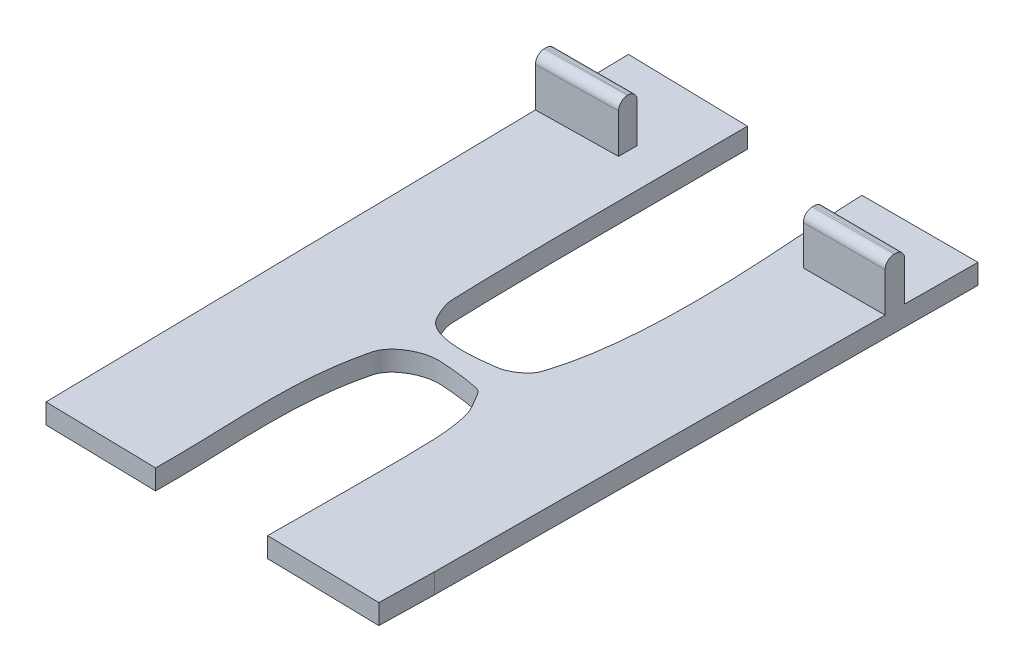
ISO-10303-21;
HEADER;
FILE_DESCRIPTION(('STEP AP214'),'2;1');
FILE_NAME('part.step','',(''),(''),'','','');
FILE_SCHEMA(('AUTOMOTIVE_DESIGN { 1 0 10303 214 1 1 1 1 }'));
ENDSEC;
DATA;
#1=APPLICATION_CONTEXT('core data for automotive mechanical design processes');
#2=APPLICATION_PROTOCOL_DEFINITION('international standard','automotive_design',2000,#1);
#3=PRODUCT_CONTEXT('',#1,'mechanical');
#4=PRODUCT('Part','Part','',(#3));
#5=PRODUCT_RELATED_PRODUCT_CATEGORY('part','',(#4));
#6=PRODUCT_DEFINITION_FORMATION('','',#4);
#7=PRODUCT_DEFINITION_CONTEXT('part definition',#1,'design');
#8=PRODUCT_DEFINITION('design','',#6,#7);
#9=PRODUCT_DEFINITION_SHAPE('','',#8);
#10=(LENGTH_UNIT() NAMED_UNIT(*) SI_UNIT(.MILLI.,.METRE.));
#11=(NAMED_UNIT(*) PLANE_ANGLE_UNIT() SI_UNIT($,.RADIAN.));
#12=(NAMED_UNIT(*) SI_UNIT($,.STERADIAN.) SOLID_ANGLE_UNIT());
#13=UNCERTAINTY_MEASURE_WITH_UNIT(LENGTH_MEASURE(1.E-05),#10,'distance_accuracy_value','');
#14=(GEOMETRIC_REPRESENTATION_CONTEXT(3) GLOBAL_UNCERTAINTY_ASSIGNED_CONTEXT((#13)) GLOBAL_UNIT_ASSIGNED_CONTEXT((#10,
#11,#12)) REPRESENTATION_CONTEXT('',''));
#15=CARTESIAN_POINT('',(0.,0.,0.));
#16=DIRECTION('',(0.,0.,1.));
#17=DIRECTION('',(1.,0.,0.));
#18=AXIS2_PLACEMENT_3D('',#15,#16,#17);
#19=CARTESIAN_POINT('',(88.3389714618213,1.,24.135500369023));
#20=DIRECTION('',(0.999866385580923,0.,-0.0163465894100423));
#21=DIRECTION('',(-0.0163465894100423,0.,-0.999866385580923));
#22=AXIS2_PLACEMENT_3D('',#19,#20,#21);
#23=PLANE('',#22);
#24=DIRECTION('',(0.0163465894100423,0.,0.999866385580923));
#25=VECTOR('',#24,1.);
#26=CARTESIAN_POINT('',(88.3389714618213,1.,24.135500369023));
#27=LINE('',#26,#25);
#28=CARTESIAN_POINT('',(87.6036054088789,1.,-20.8443898692875));
#29=VERTEX_POINT('',#28);
#30=CARTESIAN_POINT('',(87.6646436738405,1.,-17.1108826624673));
#31=VERTEX_POINT('',#30);
#32=EDGE_CURVE('E227',#29,#31,#27,.T.);
#33=ORIENTED_EDGE('',*,*,#32,.F.);
#34=DIRECTION('',(0.,1.,0.));
#35=VECTOR('',#34,1.);
#36=CARTESIAN_POINT('',(87.6036054088789,-9.,-20.8443898692875));
#37=LINE('',#36,#35);
#38=CARTESIAN_POINT('',(87.6036054088789,0.,-20.8443898692875));
#39=VERTEX_POINT('',#38);
#40=EDGE_CURVE('E352',#39,#29,#37,.T.);
#41=ORIENTED_EDGE('',*,*,#40,.F.);
#42=DIRECTION('',(0.0163465894100423,0.,0.999866385580923));
#43=VECTOR('',#42,1.);
#44=CARTESIAN_POINT('',(88.3389714618213,0.,24.135500369023));
#45=LINE('',#44,#43);
#46=CARTESIAN_POINT('',(88.0876826334834,0.,8.76500036902299));
#47=VERTEX_POINT('',#46);
#48=EDGE_CURVE('E327',#39,#47,#45,.T.);
#49=ORIENTED_EDGE('',*,*,#48,.T.);
#50=DIRECTION('',(0.,1.,0.));
#51=VECTOR('',#50,1.);
#52=CARTESIAN_POINT('',(88.0876826334834,-9.,8.76500036902299));
#53=LINE('',#52,#51);
#54=CARTESIAN_POINT('',(88.0876826334834,1.,8.76500036902299));
#55=VERTEX_POINT('',#54);
#56=EDGE_CURVE('E329',#47,#55,#53,.T.);
#57=ORIENTED_EDGE('',*,*,#56,.T.);
#58=CARTESIAN_POINT('',(87.6809902632506,1.,-16.1110162768864));
#59=VERTEX_POINT('',#58);
#60=EDGE_CURVE('E223',#59,#55,#27,.T.);
#61=ORIENTED_EDGE('',*,*,#60,.F.);
#62=DIRECTION('',(0.,-1.,0.));
#63=VECTOR('',#62,1.);
#64=CARTESIAN_POINT('',(87.6809902632506,3.42,-16.1110162768864));
#65=LINE('',#64,#63);
#66=CARTESIAN_POINT('',(87.6809902632506,2.97,-16.1110162768864));
#67=VERTEX_POINT('',#66);
#68=EDGE_CURVE('E448',#67,#59,#65,.T.);
#69=ORIENTED_EDGE('',*,*,#68,.F.);
#70=CARTESIAN_POINT('',(87.6736342980161,2.97,-16.5609561503978));
#71=DIRECTION('',(0.999866385580923,0.,-0.0163465894100423));
#72=DIRECTION('',(-0.0163465894100423,0.,-0.999866385580923));
#73=AXIS2_PLACEMENT_3D('',#70,#71,#72);
#74=CIRCLE('',#73,0.45);
#75=CARTESIAN_POINT('',(87.6736342980161,3.42,-16.5609561503978));
#76=VERTEX_POINT('',#75);
#77=EDGE_CURVE('E334',#67,#76,#74,.F.);
#78=ORIENTED_EDGE('',*,*,#77,.T.);
#79=DIRECTION('',(0.0163465894100351,0.,0.999866385580923));
#80=VECTOR('',#79,1.);
#81=CARTESIAN_POINT('',(87.6646436738405,3.42,-17.1108826624673));
#82=LINE('',#81,#80);
#83=CARTESIAN_POINT('',(87.6720006220694,3.42,-16.6608826624673));
#84=VERTEX_POINT('',#83);
#85=EDGE_CURVE('E417',#84,#76,#82,.T.);
#86=ORIENTED_EDGE('',*,*,#85,.F.);
#87=CARTESIAN_POINT('',(87.6720006220694,2.97,-16.6608826624673));
#88=DIRECTION('',(0.999866385580923,0.,-0.0163465894100423));
#89=DIRECTION('',(0.0163465894100423,0.,0.999866385580923));
#90=AXIS2_PLACEMENT_3D('',#87,#88,#89);
#91=ELLIPSE('',#90,0.450060134523424,0.45);
#92=CARTESIAN_POINT('',(87.6646436738405,2.97,-17.1108826624673));
#93=VERTEX_POINT('',#92);
#94=EDGE_CURVE('E322',#84,#93,#91,.F.);
#95=ORIENTED_EDGE('',*,*,#94,.T.);
#96=DIRECTION('',(0.,-1.,0.));
#97=VECTOR('',#96,1.);
#98=CARTESIAN_POINT('',(87.6646436738405,3.42,-17.1108826624673));
#99=LINE('',#98,#97);
#100=EDGE_CURVE('E316',#93,#31,#99,.T.);
#101=ORIENTED_EDGE('',*,*,#100,.T.);
#102=EDGE_LOOP('',(#33,#41,#49,#57,#61,#69,#78,#86,#95,#101));
#103=FACE_BOUND('',#102,.T.);
#104=ADVANCED_FACE('F38',(#103),#23,.F.);
#105=CARTESIAN_POINT('',(105.416487085937,1.,-31.1382906586502));
#106=DIRECTION('',(-0.999975888217774,0.,-0.0069442770015123));
#107=DIRECTION('',(-0.00694427700151229,0.,0.999975888217774));
#108=AXIS2_PLACEMENT_3D('',#105,#106,#107);
#109=PLANE('',#108);
#110=DIRECTION('',(0.00694427700151229,0.,-0.999975888217774));
#111=VECTOR('',#110,1.);
#112=CARTESIAN_POINT('',(105.416487085937,0.,-31.1382906586502));
#113=LINE('',#112,#111);
#114=CARTESIAN_POINT('',(105.155761656561,0.,6.40617117146744));
#115=VERTEX_POINT('',#114);
#116=CARTESIAN_POINT('',(105.343158058925,0.,-20.5789107689296));
#117=VERTEX_POINT('',#116);
#118=EDGE_CURVE('E312',#115,#117,#113,.T.);
#119=ORIENTED_EDGE('',*,*,#118,.T.);
#120=DIRECTION('',(0.,1.,0.));
#121=VECTOR('',#120,1.);
#122=CARTESIAN_POINT('',(105.343158058925,-9.,-20.5789107689296));
#123=LINE('',#122,#121);
#124=CARTESIAN_POINT('',(105.343158058925,1.,-20.5789107689296));
#125=VERTEX_POINT('',#124);
#126=EDGE_CURVE('E67',#117,#125,#123,.T.);
#127=ORIENTED_EDGE('',*,*,#126,.T.);
#128=DIRECTION('',(0.00694427700151229,0.,-0.999975888217774));
#129=VECTOR('',#128,1.);
#130=CARTESIAN_POINT('',(105.416487085937,1.,-31.1382906586502));
#131=LINE('',#130,#129);
#132=CARTESIAN_POINT('',(105.317880281148,1.,-16.9389107689296));
#133=VERTEX_POINT('',#132);
#134=EDGE_CURVE('E217',#133,#125,#131,.T.);
#135=ORIENTED_EDGE('',*,*,#134,.F.);
#136=DIRECTION('',(0.,-1.,0.));
#137=VECTOR('',#136,1.);
#138=CARTESIAN_POINT('',(105.317880281148,3.42,-16.9389107689296));
#139=LINE('',#138,#137);
#140=CARTESIAN_POINT('',(105.317880281148,2.97,-16.9389107689296));
#141=VERTEX_POINT('',#140);
#142=EDGE_CURVE('E399',#141,#133,#139,.T.);
#143=ORIENTED_EDGE('',*,*,#142,.F.);
#144=CARTESIAN_POINT('',(105.314755356497,2.97,-16.4889216192316));
#145=DIRECTION('',(-0.999975888217774,0.,-0.0069442770015123));
#146=DIRECTION('',(-0.00694427700151229,0.,0.999975888217774));
#147=AXIS2_PLACEMENT_3D('',#144,#145,#146);
#148=CIRCLE('',#147,0.45);
#149=CARTESIAN_POINT('',(105.314755356497,3.42,-16.4889216192316));
#150=VERTEX_POINT('',#149);
#151=EDGE_CURVE('E320',#141,#150,#148,.F.);
#152=ORIENTED_EDGE('',*,*,#151,.T.);
#153=DIRECTION('',(0.00694427700151083,0.,-0.999975888217774));
#154=VECTOR('',#153,1.);
#155=CARTESIAN_POINT('',(105.311133403586,3.42,-15.9673604000238));
#156=LINE('',#155,#154);
#157=CARTESIAN_POINT('',(105.314258403586,3.42,-16.4173604000238));
#158=VERTEX_POINT('',#157);
#159=EDGE_CURVE('E361',#158,#150,#156,.T.);
#160=ORIENTED_EDGE('',*,*,#159,.F.);
#161=CARTESIAN_POINT('',(105.314258403586,2.97,-16.4173604000238));
#162=DIRECTION('',(-0.999975888217774,0.,-0.0069442770015123));
#163=DIRECTION('',(-0.00694427700151229,0.,0.999975888217774));
#164=AXIS2_PLACEMENT_3D('',#161,#162,#163);
#165=ELLIPSE('',#164,0.450010850563628,0.45);
#166=CARTESIAN_POINT('',(105.311133403586,2.97,-15.9673604000238));
#167=VERTEX_POINT('',#166);
#168=EDGE_CURVE('E486',#158,#167,#165,.F.);
#169=ORIENTED_EDGE('',*,*,#168,.T.);
#170=DIRECTION('',(0.,-1.,0.));
#171=VECTOR('',#170,1.);
#172=CARTESIAN_POINT('',(105.311133403586,3.42,-15.9673604000238));
#173=LINE('',#172,#171);
#174=CARTESIAN_POINT('',(105.311133403586,1.,-15.9673604000238));
#175=VERTEX_POINT('',#174);
#176=EDGE_CURVE('E219',#167,#175,#173,.T.);
#177=ORIENTED_EDGE('',*,*,#176,.T.);
#178=CARTESIAN_POINT('',(105.155761656561,1.,6.40617117146744));
#179=VERTEX_POINT('',#178);
#180=EDGE_CURVE('E213',#179,#175,#131,.T.);
#181=ORIENTED_EDGE('',*,*,#180,.F.);
#182=DIRECTION('',(0.,-1.,0.));
#183=VECTOR('',#182,1.);
#184=CARTESIAN_POINT('',(105.155761656561,1.,6.40617117146744));
#185=LINE('',#184,#183);
#186=EDGE_CURVE('E210',#179,#115,#185,.T.);
#187=ORIENTED_EDGE('',*,*,#186,.T.);
#188=EDGE_LOOP('',(#119,#127,#135,#143,#152,#160,#169,#177,#181,#187));
#189=FACE_BOUND('',#188,.T.);
#190=ADVANCED_FACE('F301',(#189),#109,.F.);
#191=CARTESIAN_POINT('',(62.4947593620138,1.,-34.1363669338565));
#192=DIRECTION('',(0.,1.,0.));
#193=DIRECTION('',(0.,0.,1.));
#194=AXIS2_PLACEMENT_3D('',#191,#192,#193);
#195=PLANE('',#194);
#196=DIRECTION('',(-0.999777531834694,0.,-0.0210923407550632));
#197=VECTOR('',#196,1.);
#198=CARTESIAN_POINT('',(88.0876826334834,1.,8.76500036902299));
#199=LINE('',#198,#197);
#200=CARTESIAN_POINT('',(93.6838427640256,1.,8.88306275053769));
#201=VERTEX_POINT('',#200);
#202=EDGE_CURVE('E341',#201,#55,#199,.T.);
#203=ORIENTED_EDGE('',*,*,#202,.F.);
#204=CARTESIAN_POINT('',(99.4198022102935,1.,9.0134254652256));
#205=CARTESIAN_POINT('',(99.4198022102935,1.,6.31926269500883));
#206=CARTESIAN_POINT('',(99.4888606090527,1.,3.62421470618093));
#207=CARTESIAN_POINT('',(99.4198022102935,1.,0.930937154575276));
#208=CARTESIAN_POINT('',(99.4018419970522,1.,0.230488838163951));
#209=CARTESIAN_POINT('',(99.3290162880135,1.,-0.475108252048224));
#210=CARTESIAN_POINT('',(99.1590767809177,1.,-1.15486628043125));
#211=CARTESIAN_POINT('',(99.0648113029853,1.,-1.531928192161));
#212=CARTESIAN_POINT('',(98.8263790713383,1.,-1.85801232942451));
#213=CARTESIAN_POINT('',(98.6376259221661,1.,-2.19776799793452));
#214=CARTESIAN_POINT('',(98.548092442129,1.,-2.35892826200124));
#215=CARTESIAN_POINT('',(98.4265083265325,1.,-2.54886268679156));
#216=CARTESIAN_POINT('',(98.2465377781024,1.,-2.58885614199825));
#217=CARTESIAN_POINT('',(97.5625444562303,1.,-2.74085465796982));
#218=CARTESIAN_POINT('',(96.8606198092129,1.,-2.81625369203516));
#219=CARTESIAN_POINT('',(96.1607343430958,1.,-2.84958157137407));
#220=CARTESIAN_POINT('',(95.3785565638246,1.,-2.88682813229175));
#221=CARTESIAN_POINT('',(94.2734415063584,1.,-2.33999681757149));
#222=CARTESIAN_POINT('',(94.0749309080893,1.,-1.54595442449498));
#223=CARTESIAN_POINT('',(93.2303094608036,1.,1.83253136464772));
#224=CARTESIAN_POINT('',(93.7380848795468,1.,4.97763043301012));
#225=CARTESIAN_POINT('',(93.6838427640256,1.,8.88306275053769));
#226=B_SPLINE_CURVE_WITH_KNOTS('',3,(#204,#205,#206,#207,#208,#209,#210,#211,#212,#213,#214,
#215,#216,#217,#218,#219,#220,#221,#222,#223,#224,#225),.UNSPECIFIED.,.F.,.F.,(4,3,3,3,3,3,3,4),
(0.,1.,2.,3.,4.,5.,6.,7.),.UNSPECIFIED.);
#227=CARTESIAN_POINT('',(99.4198022102935,1.,9.0134254652256));
#228=VERTEX_POINT('',#227);
#229=EDGE_CURVE('E204',#228,#201,#226,.T.);
#230=ORIENTED_EDGE('',*,*,#229,.F.);
#231=DIRECTION('',(-0.999777385803806,0.,-0.0210992614872563));
#232=VECTOR('',#231,1.);
#233=CARTESIAN_POINT('',(99.4198022102935,1.,9.0134254652256));
#234=LINE('',#233,#232);
#235=CARTESIAN_POINT('',(105.096477860324,1.,9.13322579839881));
#236=VERTEX_POINT('',#235);
#237=EDGE_CURVE('E186',#236,#228,#234,.T.);
#238=ORIENTED_EDGE('',*,*,#237,.F.);
#239=DIRECTION('',(0.0217339954092151,0.,-0.999763788823916));
#240=VECTOR('',#239,1.);
#241=CARTESIAN_POINT('',(105.155761656561,1.,6.40617117146744));
#242=LINE('',#241,#240);
#243=EDGE_CURVE('E201',#236,#179,#242,.T.);
#244=ORIENTED_EDGE('',*,*,#243,.T.);
#245=ORIENTED_EDGE('',*,*,#180,.T.);
#246=DIRECTION('',(1.,0.,0.));
#247=VECTOR('',#246,1.);
#248=CARTESIAN_POINT('',(101.221133403586,1.,-15.9673604000238));
#249=LINE('',#248,#247);
#250=CARTESIAN_POINT('',(101.221133403586,1.,-15.9673604000238));
#251=VERTEX_POINT('',#250);
#252=EDGE_CURVE('E372',#251,#175,#249,.T.);
#253=ORIENTED_EDGE('',*,*,#252,.F.);
#254=DIRECTION('',(0.,0.,1.));
#255=VECTOR('',#254,1.);
#256=CARTESIAN_POINT('',(101.221133403586,1.,-16.9673604000238));
#257=LINE('',#256,#255);
#258=CARTESIAN_POINT('',(101.221133403586,1.,-16.9673604000238));
#259=VERTEX_POINT('',#258);
#260=EDGE_CURVE('E382',#259,#251,#257,.T.);
#261=ORIENTED_EDGE('',*,*,#260,.F.);
#262=DIRECTION('',(-0.999975888217774,0.,-0.00694427700151164));
#263=VECTOR('',#262,1.);
#264=CARTESIAN_POINT('',(105.317880281148,1.,-16.9389107689296));
#265=LINE('',#264,#263);
#266=EDGE_CURVE('E395',#133,#259,#265,.T.);
#267=ORIENTED_EDGE('',*,*,#266,.F.);
#268=ORIENTED_EDGE('',*,*,#134,.T.);
#269=DIRECTION('',(1.,0.,0.));
#270=VECTOR('',#269,1.);
#271=CARTESIAN_POINT('',(99.5501649249814,1.,-20.5789107689296));
#272=LINE('',#271,#270);
#273=CARTESIAN_POINT('',(99.5501649249814,1.,-20.5789107689296));
#274=VERTEX_POINT('',#273);
#275=EDGE_CURVE('E74',#274,#125,#272,.T.);
#276=ORIENTED_EDGE('',*,*,#275,.F.);
#277=CARTESIAN_POINT('',(93.6838427640256,1.,-20.7092734836175));
#278=CARTESIAN_POINT('',(93.7272970022549,1.,-15.755490325477));
#279=CARTESIAN_POINT('',(93.6531857639699,1.,-10.7992802375601));
#280=CARTESIAN_POINT('',(93.8142054787135,1.,-5.84792400919596));
#281=CARTESIAN_POINT('',(93.8276046749684,1.,-5.43589872435566));
#282=CARTESIAN_POINT('',(94.0209329036378,1.,-5.04338101528362));
#283=CARTESIAN_POINT('',(94.2052936227772,1.,-4.67465957700479));
#284=CARTESIAN_POINT('',(94.7894507258167,1.,-3.50634537092571));
#285=CARTESIAN_POINT('',(97.3343076905273,1.,-3.91860525825336));
#286=CARTESIAN_POINT('',(97.9858123487265,1.,-4.02284600356524));
#287=CARTESIAN_POINT('',(98.3728657605785,1.,-4.08477454946156));
#288=CARTESIAN_POINT('',(99.0177771498145,1.,-4.51148611307088));
#289=CARTESIAN_POINT('',(99.1590767809177,1.,-4.9353850063806));
#290=CARTESIAN_POINT('',(100.740759834458,1.,-9.68043416700239));
#291=CARTESIAN_POINT('',(99.5292315304134,1.,-18.1925037881732));
#292=CARTESIAN_POINT('',(99.5501649249814,1.,-20.5789107689296));
#293=B_SPLINE_CURVE_WITH_KNOTS('',3,(#277,#278,#279,#280,#281,#282,#283,#284,#285,#286,#287,
#288,#289,#290,#291,#292),.UNSPECIFIED.,.F.,.F.,(4,3,3,3,3,4),(0.,1.,2.,3.,4.,5.),.UNSPECIFIED.);
#294=CARTESIAN_POINT('',(93.6838427640256,1.,-20.7092734836175));
#295=VERTEX_POINT('',#294);
#296=EDGE_CURVE('E229',#295,#274,#293,.T.);
#297=ORIENTED_EDGE('',*,*,#296,.F.);
#298=DIRECTION('',(0.99975317783161,0.,0.0222167372851469));
#299=VECTOR('',#298,1.);
#300=CARTESIAN_POINT('',(93.6838427640256,1.,-20.7092734836175));
#301=LINE('',#300,#299);
#302=EDGE_CURVE('E41',#29,#295,#301,.T.);
#303=ORIENTED_EDGE('',*,*,#302,.F.);
#304=ORIENTED_EDGE('',*,*,#32,.T.);
#305=DIRECTION('',(-1.,0.,0.));
#306=VECTOR('',#305,1.);
#307=CARTESIAN_POINT('',(91.7709902632506,1.,-17.1108826624673));
#308=LINE('',#307,#306);
#309=CARTESIAN_POINT('',(91.7709902632506,1.,-17.1108826624673));
#310=VERTEX_POINT('',#309);
#311=EDGE_CURVE('E421',#310,#31,#308,.T.);
#312=ORIENTED_EDGE('',*,*,#311,.F.);
#313=DIRECTION('',(0.,0.,-1.));
#314=VECTOR('',#313,1.);
#315=CARTESIAN_POINT('',(91.7709902632506,1.,-16.1778827619));
#316=LINE('',#315,#314);
#317=CARTESIAN_POINT('',(91.7709902632506,1.,-16.1778827619));
#318=VERTEX_POINT('',#317);
#319=EDGE_CURVE('E434',#318,#310,#316,.T.);
#320=ORIENTED_EDGE('',*,*,#319,.F.);
#321=DIRECTION('',(0.999866385580923,0.,-0.0163465894100426));
#322=VECTOR('',#321,1.);
#323=CARTESIAN_POINT('',(87.6809902632506,1.,-16.1110162768864));
#324=LINE('',#323,#322);
#325=EDGE_CURVE('E444',#59,#318,#324,.T.);
#326=ORIENTED_EDGE('',*,*,#325,.F.);
#327=ORIENTED_EDGE('',*,*,#60,.T.);
#328=EDGE_LOOP('',(#203,#230,#238,#244,#245,#253,#261,#267,#268,#276,#297,#303,#304,#312,#320,
#326,#327));
#329=FACE_BOUND('',#328,.T.);
#330=ADVANCED_FACE('F199',(#329),#195,.T.);
#331=CARTESIAN_POINT('',(62.4947593620138,0.,-34.1363669338565));
#332=DIRECTION('',(0.,1.,0.));
#333=DIRECTION('',(0.,0.,1.));
#334=AXIS2_PLACEMENT_3D('',#331,#332,#333);
#335=PLANE('',#334);
#336=CARTESIAN_POINT('',(93.6838427640256,0.,-20.7092734836175));
#337=CARTESIAN_POINT('',(93.7272970022549,0.,-15.755490325477));
#338=CARTESIAN_POINT('',(93.6531857639699,0.,-10.7992802375601));
#339=CARTESIAN_POINT('',(93.8142054787135,0.,-5.84792400919596));
#340=CARTESIAN_POINT('',(93.8276046749684,0.,-5.43589872435566));
#341=CARTESIAN_POINT('',(94.0209329036378,0.,-5.04338101528362));
#342=CARTESIAN_POINT('',(94.2052936227772,0.,-4.67465957700479));
#343=CARTESIAN_POINT('',(94.7894507258167,0.,-3.50634537092571));
#344=CARTESIAN_POINT('',(97.3343076905273,0.,-3.91860525825336));
#345=CARTESIAN_POINT('',(97.9858123487265,0.,-4.02284600356524));
#346=CARTESIAN_POINT('',(98.3728657605785,0.,-4.08477454946156));
#347=CARTESIAN_POINT('',(99.0177771498145,0.,-4.51148611307088));
#348=CARTESIAN_POINT('',(99.1590767809177,0.,-4.9353850063806));
#349=CARTESIAN_POINT('',(100.740759834458,0.,-9.68043416700239));
#350=CARTESIAN_POINT('',(99.5292315304134,0.,-18.1925037881732));
#351=CARTESIAN_POINT('',(99.5501649249814,0.,-20.5789107689296));
#352=B_SPLINE_CURVE_WITH_KNOTS('',3,(#336,#337,#338,#339,#340,#341,#342,#343,#344,#345,#346,
#347,#348,#349,#350,#351),.UNSPECIFIED.,.F.,.F.,(4,3,3,3,3,4),(0.,1.,2.,3.,4.,5.),.UNSPECIFIED.);
#353=CARTESIAN_POINT('',(93.6838427640256,0.,-20.7092734836175));
#354=VERTEX_POINT('',#353);
#355=CARTESIAN_POINT('',(99.5501649249814,0.,-20.5789107689296));
#356=VERTEX_POINT('',#355);
#357=EDGE_CURVE('E226',#354,#356,#352,.T.);
#358=ORIENTED_EDGE('',*,*,#357,.T.);
#359=DIRECTION('',(1.,0.,0.));
#360=VECTOR('',#359,1.);
#361=CARTESIAN_POINT('',(62.4947593620138,0.,-20.5789107689296));
#362=LINE('',#361,#360);
#363=EDGE_CURVE('E349',#356,#117,#362,.T.);
#364=ORIENTED_EDGE('',*,*,#363,.T.);
#365=ORIENTED_EDGE('',*,*,#118,.F.);
#366=DIRECTION('',(0.0217339954092151,0.,-0.999763788823916));
#367=VECTOR('',#366,1.);
#368=CARTESIAN_POINT('',(105.155761656561,0.,6.40617117146744));
#369=LINE('',#368,#367);
#370=CARTESIAN_POINT('',(105.096477860324,0.,9.13322579839881));
#371=VERTEX_POINT('',#370);
#372=EDGE_CURVE('E237',#371,#115,#369,.T.);
#373=ORIENTED_EDGE('',*,*,#372,.F.);
#374=DIRECTION('',(-0.999777385803806,0.,-0.0210992614872563));
#375=VECTOR('',#374,1.);
#376=CARTESIAN_POINT('',(61.6009715309986,0.,8.21529839316428));
#377=LINE('',#376,#375);
#378=CARTESIAN_POINT('',(99.4198022102935,0.,9.0134254652256));
#379=VERTEX_POINT('',#378);
#380=EDGE_CURVE('E189',#371,#379,#377,.T.);
#381=ORIENTED_EDGE('',*,*,#380,.T.);
#382=CARTESIAN_POINT('',(99.4198022102935,0.,9.0134254652256));
#383=CARTESIAN_POINT('',(99.4198022102935,0.,6.31926269500883));
#384=CARTESIAN_POINT('',(99.4888606090527,0.,3.62421470618093));
#385=CARTESIAN_POINT('',(99.4198022102935,0.,0.930937154575276));
#386=CARTESIAN_POINT('',(99.4018419970522,0.,0.230488838163951));
#387=CARTESIAN_POINT('',(99.3290162880135,0.,-0.475108252048224));
#388=CARTESIAN_POINT('',(99.1590767809177,0.,-1.15486628043125));
#389=CARTESIAN_POINT('',(99.0648113029853,0.,-1.531928192161));
#390=CARTESIAN_POINT('',(98.8263790713383,0.,-1.85801232942451));
#391=CARTESIAN_POINT('',(98.6376259221661,0.,-2.19776799793452));
#392=CARTESIAN_POINT('',(98.548092442129,0.,-2.35892826200124));
#393=CARTESIAN_POINT('',(98.4265083265325,0.,-2.54886268679156));
#394=CARTESIAN_POINT('',(98.2465377781024,0.,-2.58885614199825));
#395=CARTESIAN_POINT('',(97.5625444562303,0.,-2.74085465796982));
#396=CARTESIAN_POINT('',(96.8606198092129,0.,-2.81625369203516));
#397=CARTESIAN_POINT('',(96.1607343430958,0.,-2.84958157137407));
#398=CARTESIAN_POINT('',(95.3785565638246,0.,-2.88682813229175));
#399=CARTESIAN_POINT('',(94.2734415063584,0.,-2.33999681757149));
#400=CARTESIAN_POINT('',(94.0749309080893,0.,-1.54595442449498));
#401=CARTESIAN_POINT('',(93.2303094608036,0.,1.83253136464772));
#402=CARTESIAN_POINT('',(93.7380848795468,0.,4.97763043301012));
#403=CARTESIAN_POINT('',(93.6838427640256,0.,8.88306275053769));
#404=B_SPLINE_CURVE_WITH_KNOTS('',3,(#382,#383,#384,#385,#386,#387,#388,#389,#390,#391,#392,
#393,#394,#395,#396,#397,#398,#399,#400,#401,#402,#403),.UNSPECIFIED.,.F.,.F.,(4,3,3,3,3,3,3,4),
(0.,1.,2.,3.,4.,5.,6.,7.),.UNSPECIFIED.);
#405=CARTESIAN_POINT('',(93.6838427640256,0.,8.88306275053769));
#406=VERTEX_POINT('',#405);
#407=EDGE_CURVE('E464',#379,#406,#404,.T.);
#408=ORIENTED_EDGE('',*,*,#407,.T.);
#409=DIRECTION('',(-0.999777531834694,0.,-0.0210923407550632));
#410=VECTOR('',#409,1.);
#411=CARTESIAN_POINT('',(61.6014563680017,0.,8.20621954837176));
#412=LINE('',#411,#410);
#413=EDGE_CURVE('E346',#406,#47,#412,.T.);
#414=ORIENTED_EDGE('',*,*,#413,.T.);
#415=ORIENTED_EDGE('',*,*,#48,.F.);
#416=DIRECTION('',(0.99975317783161,0.,0.0222167372851469));
#417=VECTOR('',#416,1.);
#418=CARTESIAN_POINT('',(62.2119211972266,0.,-21.4086495184353));
#419=LINE('',#418,#417);
#420=EDGE_CURVE('E55',#39,#354,#419,.T.);
#421=ORIENTED_EDGE('',*,*,#420,.T.);
#422=EDGE_LOOP('',(#358,#364,#365,#373,#381,#408,#414,#415,#421));
#423=FACE_BOUND('',#422,.T.);
#424=ADVANCED_FACE('F308',(#423),#335,.F.);
#425=CARTESIAN_POINT('',(105.155761656561,1.,6.40617117146744));
#426=DIRECTION('',(-0.999763788823916,0.,-0.0217339954092151));
#427=DIRECTION('',(-0.0217339954092151,0.,0.999763788823916));
#428=AXIS2_PLACEMENT_3D('',#425,#426,#427);
#429=PLANE('',#428);
#430=ORIENTED_EDGE('',*,*,#243,.F.);
#431=DIRECTION('',(0.,1.,0.));
#432=VECTOR('',#431,1.);
#433=CARTESIAN_POINT('',(105.096477860324,-9.,9.13322579839881));
#434=LINE('',#433,#432);
#435=EDGE_CURVE('E183',#371,#236,#434,.T.);
#436=ORIENTED_EDGE('',*,*,#435,.F.);
#437=ORIENTED_EDGE('',*,*,#372,.T.);
#438=ORIENTED_EDGE('',*,*,#186,.F.);
#439=EDGE_LOOP('',(#430,#436,#437,#438));
#440=FACE_BOUND('',#439,.T.);
#441=ADVANCED_FACE('F208',(#440),#429,.F.);
#442=DIRECTION('',(0.,-1.,0.));
#443=VECTOR('',#442,1.);
#444=SURFACE_OF_LINEAR_EXTRUSION('',#293,#443);
#445=ORIENTED_EDGE('',*,*,#357,.F.);
#446=DIRECTION('',(0.,-1.,0.));
#447=VECTOR('',#446,1.);
#448=CARTESIAN_POINT('',(93.6838427640256,1.,-20.7092734836175));
#449=LINE('',#448,#447);
#450=EDGE_CURVE('E11',#295,#354,#449,.T.);
#451=ORIENTED_EDGE('',*,*,#450,.F.);
#452=ORIENTED_EDGE('',*,*,#296,.T.);
#453=DIRECTION('',(0.,-1.,0.));
#454=VECTOR('',#453,1.);
#455=CARTESIAN_POINT('',(99.5501649249814,1.,-20.5789107689296));
#456=LINE('',#455,#454);
#457=EDGE_CURVE('E236',#274,#356,#456,.T.);
#458=ORIENTED_EDGE('',*,*,#457,.T.);
#459=EDGE_LOOP('',(#445,#451,#452,#458));
#460=FACE_BOUND('',#459,.T.);
#461=ADVANCED_FACE('F246',(#460),#444,.T.);
#462=DIRECTION('',(0.,-1.,0.));
#463=VECTOR('',#462,1.);
#464=SURFACE_OF_LINEAR_EXTRUSION('',#226,#463);
#465=ORIENTED_EDGE('',*,*,#407,.F.);
#466=DIRECTION('',(0.,-1.,0.));
#467=VECTOR('',#466,1.);
#468=CARTESIAN_POINT('',(99.4198022102935,1.,9.0134254652256));
#469=LINE('',#468,#467);
#470=EDGE_CURVE('E206',#228,#379,#469,.T.);
#471=ORIENTED_EDGE('',*,*,#470,.F.);
#472=ORIENTED_EDGE('',*,*,#229,.T.);
#473=DIRECTION('',(0.,-1.,0.));
#474=VECTOR('',#473,1.);
#475=CARTESIAN_POINT('',(93.6838427640256,1.,8.88306275053769));
#476=LINE('',#475,#474);
#477=EDGE_CURVE('E453',#201,#406,#476,.T.);
#478=ORIENTED_EDGE('',*,*,#477,.T.);
#479=EDGE_LOOP('',(#465,#471,#472,#478));
#480=FACE_BOUND('',#479,.T.);
#481=ADVANCED_FACE('F250',(#480),#464,.T.);
#482=CARTESIAN_POINT('',(87.6809902632506,3.42,-16.1110162768864));
#483=DIRECTION('',(-0.0163465894100426,0.,-0.999866385580923));
#484=DIRECTION('',(-0.999866385580923,0.,0.0163465894100426));
#485=AXIS2_PLACEMENT_3D('',#482,#483,#484);
#486=PLANE('',#485);
#487=DIRECTION('',(0.,-1.,0.));
#488=VECTOR('',#487,1.);
#489=CARTESIAN_POINT('',(91.7709902632506,3.42,-16.1778827619));
#490=LINE('',#489,#488);
#491=CARTESIAN_POINT('',(91.7709902632506,2.97,-16.1778827619));
#492=VERTEX_POINT('',#491);
#493=EDGE_CURVE('E438',#492,#318,#490,.T.);
#494=ORIENTED_EDGE('',*,*,#493,.F.);
#495=DIRECTION('',(0.999866385580923,0.,-0.0163465894100426));
#496=VECTOR('',#495,1.);
#497=CARTESIAN_POINT('',(87.6809902632506,2.97,-16.1110162768864));
#498=LINE('',#497,#496);
#499=EDGE_CURVE('E451',#492,#67,#498,.F.);
#500=ORIENTED_EDGE('',*,*,#499,.T.);
#501=ORIENTED_EDGE('',*,*,#68,.T.);
#502=ORIENTED_EDGE('',*,*,#325,.T.);
#503=EDGE_LOOP('',(#494,#500,#501,#502));
#504=FACE_BOUND('',#503,.T.);
#505=ADVANCED_FACE('F255',(#504),#486,.F.);
#506=CARTESIAN_POINT('',(91.7709902632506,3.42,-16.1778827619));
#507=DIRECTION('',(-1.,0.,0.));
#508=DIRECTION('',(0.,0.,1.));
#509=AXIS2_PLACEMENT_3D('',#506,#507,#508);
#510=PLANE('',#509);
#511=DIRECTION('',(0.,0.,-1.));
#512=VECTOR('',#511,1.);
#513=CARTESIAN_POINT('',(91.7709902632506,3.42,-16.1778827619));
#514=LINE('',#513,#512);
#515=CARTESIAN_POINT('',(91.7709902632506,3.42,-16.6279428964234));
#516=VERTEX_POINT('',#515);
#517=CARTESIAN_POINT('',(91.7709902632506,3.42,-16.6608826624673));
#518=VERTEX_POINT('',#517);
#519=EDGE_CURVE('E409',#516,#518,#514,.T.);
#520=ORIENTED_EDGE('',*,*,#519,.F.);
#521=CARTESIAN_POINT('',(91.7709902632506,2.97,-16.6279428964234));
#522=DIRECTION('',(-1.,0.,0.));
#523=DIRECTION('',(0.,0.,1.));
#524=AXIS2_PLACEMENT_3D('',#521,#522,#523);
#525=ELLIPSE('',#524,0.450060134523424,0.45);
#526=EDGE_CURVE('E441',#516,#492,#525,.F.);
#527=ORIENTED_EDGE('',*,*,#526,.T.);
#528=ORIENTED_EDGE('',*,*,#493,.T.);
#529=ORIENTED_EDGE('',*,*,#319,.T.);
#530=DIRECTION('',(0.,-1.,0.));
#531=VECTOR('',#530,1.);
#532=CARTESIAN_POINT('',(91.7709902632506,3.42,-17.1108826624673));
#533=LINE('',#532,#531);
#534=CARTESIAN_POINT('',(91.7709902632506,2.97,-17.1108826624673));
#535=VERTEX_POINT('',#534);
#536=EDGE_CURVE('E425',#535,#310,#533,.T.);
#537=ORIENTED_EDGE('',*,*,#536,.F.);
#538=CARTESIAN_POINT('',(91.7709902632506,2.97,-16.6608826624673));
#539=DIRECTION('',(-1.,0.,0.));
#540=DIRECTION('',(0.,0.,1.));
#541=AXIS2_PLACEMENT_3D('',#538,#539,#540);
#542=CIRCLE('',#541,0.45);
#543=EDGE_CURVE('E431',#535,#518,#542,.F.);
#544=ORIENTED_EDGE('',*,*,#543,.T.);
#545=EDGE_LOOP('',(#520,#527,#528,#529,#537,#544));
#546=FACE_BOUND('',#545,.T.);
#547=ADVANCED_FACE('F259',(#546),#510,.F.);
#548=CARTESIAN_POINT('',(91.7709902632506,3.42,-17.1108826624673));
#549=DIRECTION('',(0.,0.,1.));
#550=DIRECTION('',(1.,0.,0.));
#551=AXIS2_PLACEMENT_3D('',#548,#549,#550);
#552=PLANE('',#551);
#553=ORIENTED_EDGE('',*,*,#100,.F.);
#554=DIRECTION('',(-1.,0.,0.));
#555=VECTOR('',#554,1.);
#556=CARTESIAN_POINT('',(91.7709902632506,2.97,-17.1108826624673));
#557=LINE('',#556,#555);
#558=EDGE_CURVE('E428',#93,#535,#557,.F.);
#559=ORIENTED_EDGE('',*,*,#558,.T.);
#560=ORIENTED_EDGE('',*,*,#536,.T.);
#561=ORIENTED_EDGE('',*,*,#311,.T.);
#562=EDGE_LOOP('',(#553,#559,#560,#561));
#563=FACE_BOUND('',#562,.T.);
#564=ADVANCED_FACE('F263',(#563),#552,.F.);
#565=CARTESIAN_POINT('',(0.,3.42,0.));
#566=DIRECTION('',(0.,1.,0.));
#567=DIRECTION('',(0.,0.,1.));
#568=AXIS2_PLACEMENT_3D('',#565,#566,#567);
#569=PLANE('',#568);
#570=ORIENTED_EDGE('',*,*,#85,.T.);
#571=DIRECTION('',(0.999866385580923,0.,-0.0163465894100426));
#572=VECTOR('',#571,1.);
#573=CARTESIAN_POINT('',(91.7636342980161,3.42,-16.6278226354114));
#574=LINE('',#573,#572);
#575=EDGE_CURVE('E413',#76,#516,#574,.T.);
#576=ORIENTED_EDGE('',*,*,#575,.T.);
#577=ORIENTED_EDGE('',*,*,#519,.T.);
#578=DIRECTION('',(-1.,0.,0.));
#579=VECTOR('',#578,1.);
#580=CARTESIAN_POINT('',(87.6646436738405,3.42,-16.6608826624673));
#581=LINE('',#580,#579);
#582=EDGE_CURVE('E405',#518,#84,#581,.T.);
#583=ORIENTED_EDGE('',*,*,#582,.T.);
#584=EDGE_LOOP('',(#570,#576,#577,#583));
#585=FACE_BOUND('',#584,.T.);
#586=ADVANCED_FACE('F267',(#585),#569,.T.);
#587=CARTESIAN_POINT('',(105.317880281148,3.42,-16.9389107689296));
#588=DIRECTION('',(-0.00694427700151164,0.,0.999975888217774));
#589=DIRECTION('',(0.999975888217774,0.,0.00694427700151164));
#590=AXIS2_PLACEMENT_3D('',#587,#588,#589);
#591=PLANE('',#590);
#592=DIRECTION('',(0.,-1.,0.));
#593=VECTOR('',#592,1.);
#594=CARTESIAN_POINT('',(101.221133403586,3.42,-16.9673604000238));
#595=LINE('',#594,#593);
#596=CARTESIAN_POINT('',(101.221133403586,2.97,-16.9673604000238));
#597=VERTEX_POINT('',#596);
#598=EDGE_CURVE('E386',#597,#259,#595,.T.);
#599=ORIENTED_EDGE('',*,*,#598,.F.);
#600=DIRECTION('',(-0.999975888217774,0.,-0.00694427700151164));
#601=VECTOR('',#600,1.);
#602=CARTESIAN_POINT('',(105.317880281148,2.97,-16.9389107689296));
#603=LINE('',#602,#601);
#604=EDGE_CURVE('E402',#597,#141,#603,.F.);
#605=ORIENTED_EDGE('',*,*,#604,.T.);
#606=ORIENTED_EDGE('',*,*,#142,.T.);
#607=ORIENTED_EDGE('',*,*,#266,.T.);
#608=EDGE_LOOP('',(#599,#605,#606,#607));
#609=FACE_BOUND('',#608,.T.);
#610=ADVANCED_FACE('F271',(#609),#591,.F.);
#611=CARTESIAN_POINT('',(101.221133403586,3.42,-16.9673604000238));
#612=DIRECTION('',(1.,0.,0.));
#613=DIRECTION('',(0.,0.,-1.));
#614=AXIS2_PLACEMENT_3D('',#611,#612,#613);
#615=PLANE('',#614);
#616=DIRECTION('',(0.,-1.,0.));
#617=VECTOR('',#616,1.);
#618=CARTESIAN_POINT('',(101.221133403586,3.42,-15.9673604000238));
#619=LINE('',#618,#617);
#620=CARTESIAN_POINT('',(101.221133403586,2.97,-15.9673604000238));
#621=VERTEX_POINT('',#620);
#622=EDGE_CURVE('E376',#621,#251,#619,.T.);
#623=ORIENTED_EDGE('',*,*,#622,.F.);
#624=CARTESIAN_POINT('',(101.221133403586,2.97,-16.4173604000238));
#625=DIRECTION('',(1.,0.,0.));
#626=DIRECTION('',(0.,0.,-1.));
#627=AXIS2_PLACEMENT_3D('',#624,#625,#626);
#628=CIRCLE('',#627,0.45);
#629=CARTESIAN_POINT('',(101.221133403586,3.42,-16.4173604000238));
#630=VERTEX_POINT('',#629);
#631=EDGE_CURVE('E392',#621,#630,#628,.F.);
#632=ORIENTED_EDGE('',*,*,#631,.T.);
#633=DIRECTION('',(0.,0.,1.));
#634=VECTOR('',#633,1.);
#635=CARTESIAN_POINT('',(101.221133403586,3.42,-16.9673604000238));
#636=LINE('',#635,#634);
#637=CARTESIAN_POINT('',(101.221133403586,3.42,-16.5173495494602));
#638=VERTEX_POINT('',#637);
#639=EDGE_CURVE('E368',#638,#630,#636,.T.);
#640=ORIENTED_EDGE('',*,*,#639,.F.);
#641=CARTESIAN_POINT('',(101.221133403586,2.97,-16.5173495494602));
#642=DIRECTION('',(1.,0.,0.));
#643=DIRECTION('',(0.,0.,1.));
#644=AXIS2_PLACEMENT_3D('',#641,#642,#643);
#645=ELLIPSE('',#644,0.450010850563628,0.45);
#646=EDGE_CURVE('E389',#638,#597,#645,.F.);
#647=ORIENTED_EDGE('',*,*,#646,.T.);
#648=ORIENTED_EDGE('',*,*,#598,.T.);
#649=ORIENTED_EDGE('',*,*,#260,.T.);
#650=EDGE_LOOP('',(#623,#632,#640,#647,#648,#649));
#651=FACE_BOUND('',#650,.T.);
#652=ADVANCED_FACE('F275',(#651),#615,.F.);
#653=CARTESIAN_POINT('',(101.221133403586,3.42,-15.9673604000238));
#654=DIRECTION('',(0.,0.,-1.));
#655=DIRECTION('',(-1.,0.,0.));
#656=AXIS2_PLACEMENT_3D('',#653,#654,#655);
#657=PLANE('',#656);
#658=ORIENTED_EDGE('',*,*,#176,.F.);
#659=DIRECTION('',(1.,0.,0.));
#660=VECTOR('',#659,1.);
#661=CARTESIAN_POINT('',(101.221133403586,2.97,-15.9673604000238));
#662=LINE('',#661,#660);
#663=EDGE_CURVE('E379',#167,#621,#662,.F.);
#664=ORIENTED_EDGE('',*,*,#663,.T.);
#665=ORIENTED_EDGE('',*,*,#622,.T.);
#666=ORIENTED_EDGE('',*,*,#252,.T.);
#667=EDGE_LOOP('',(#658,#664,#665,#666));
#668=FACE_BOUND('',#667,.T.);
#669=ADVANCED_FACE('F279',(#668),#657,.F.);
#670=CARTESIAN_POINT('',(0.,3.42,0.));
#671=DIRECTION('',(0.,1.,0.));
#672=DIRECTION('',(0.,0.,1.));
#673=AXIS2_PLACEMENT_3D('',#670,#671,#672);
#674=PLANE('',#673);
#675=ORIENTED_EDGE('',*,*,#639,.T.);
#676=DIRECTION('',(1.,0.,0.));
#677=VECTOR('',#676,1.);
#678=CARTESIAN_POINT('',(105.311133403586,3.42,-16.4173604000238));
#679=LINE('',#678,#677);
#680=EDGE_CURVE('E364',#630,#158,#679,.T.);
#681=ORIENTED_EDGE('',*,*,#680,.T.);
#682=ORIENTED_EDGE('',*,*,#159,.T.);
#683=DIRECTION('',(-0.999975888217774,0.,-0.00694427700151164));
#684=VECTOR('',#683,1.);
#685=CARTESIAN_POINT('',(101.218008478935,3.42,-16.5173712503258));
#686=LINE('',#685,#684);
#687=EDGE_CURVE('E194',#150,#638,#686,.T.);
#688=ORIENTED_EDGE('',*,*,#687,.T.);
#689=EDGE_LOOP('',(#675,#681,#682,#688));
#690=FACE_BOUND('',#689,.T.);
#691=ADVANCED_FACE('F283',(#690),#674,.T.);
#692=CARTESIAN_POINT('',(0.,2.97,-16.4173604000239));
#693=DIRECTION('',(-1.,0.,0.));
#694=DIRECTION('',(0.,0.,1.));
#695=AXIS2_PLACEMENT_3D('',#692,#693,#694);
#696=CYLINDRICAL_SURFACE('',#695,0.45);
#697=ORIENTED_EDGE('',*,*,#631,.F.);
#698=ORIENTED_EDGE('',*,*,#663,.F.);
#699=ORIENTED_EDGE('',*,*,#168,.F.);
#700=ORIENTED_EDGE('',*,*,#680,.F.);
#701=EDGE_LOOP('',(#697,#698,#699,#700));
#702=FACE_BOUND('',#701,.T.);
#703=ADVANCED_FACE('F287',(#702),#696,.T.);
#704=CARTESIAN_POINT('',(0.119579469958316,2.97,-17.2194436739992));
#705=DIRECTION('',(0.999975888217774,0.,0.00694427700151164));
#706=DIRECTION('',(0.00694427700151164,0.,-0.999975888217774));
#707=AXIS2_PLACEMENT_3D('',#704,#705,#706);
#708=CYLINDRICAL_SURFACE('',#707,0.45);
#709=ORIENTED_EDGE('',*,*,#151,.F.);
#710=ORIENTED_EDGE('',*,*,#604,.F.);
#711=ORIENTED_EDGE('',*,*,#646,.F.);
#712=ORIENTED_EDGE('',*,*,#687,.F.);
#713=EDGE_LOOP('',(#709,#710,#711,#712));
#714=FACE_BOUND('',#713,.T.);
#715=ADVANCED_FACE('F484',(#714),#708,.T.);
#716=CARTESIAN_POINT('',(-0.247251620771555,2.97,-15.1235574705266));
#717=DIRECTION('',(-0.999866385580923,0.,0.0163465894100426));
#718=DIRECTION('',(0.0163465894100426,0.,0.999866385580923));
#719=AXIS2_PLACEMENT_3D('',#716,#717,#718);
#720=CYLINDRICAL_SURFACE('',#719,0.45);
#721=ORIENTED_EDGE('',*,*,#77,.F.);
#722=ORIENTED_EDGE('',*,*,#499,.F.);
#723=ORIENTED_EDGE('',*,*,#526,.F.);
#724=ORIENTED_EDGE('',*,*,#575,.F.);
#725=EDGE_LOOP('',(#721,#722,#723,#724));
#726=FACE_BOUND('',#725,.T.);
#727=ADVANCED_FACE('F525',(#726),#720,.T.);
#728=CARTESIAN_POINT('',(0.,2.97,-16.6608826624674));
#729=DIRECTION('',(1.,0.,0.));
#730=DIRECTION('',(0.,0.,-1.));
#731=AXIS2_PLACEMENT_3D('',#728,#729,#730);
#732=CYLINDRICAL_SURFACE('',#731,0.45);
#733=ORIENTED_EDGE('',*,*,#543,.F.);
#734=ORIENTED_EDGE('',*,*,#558,.F.);
#735=ORIENTED_EDGE('',*,*,#94,.F.);
#736=ORIENTED_EDGE('',*,*,#582,.F.);
#737=EDGE_LOOP('',(#733,#734,#735,#736));
#738=FACE_BOUND('',#737,.T.);
#739=ADVANCED_FACE('F292',(#738),#732,.T.);
#740=CARTESIAN_POINT('',(99.4198022102935,-9.,9.0134254652256));
#741=DIRECTION('',(0.0210992614872563,0.,-0.999777385803806));
#742=DIRECTION('',(-0.999777385803806,0.,-0.0210992614872563));
#743=AXIS2_PLACEMENT_3D('',#740,#741,#742);
#744=PLANE('',#743);
#745=ORIENTED_EDGE('',*,*,#435,.T.);
#746=ORIENTED_EDGE('',*,*,#237,.T.);
#747=ORIENTED_EDGE('',*,*,#470,.T.);
#748=ORIENTED_EDGE('',*,*,#380,.F.);
#749=EDGE_LOOP('',(#745,#746,#747,#748));
#750=FACE_BOUND('',#749,.T.);
#751=ADVANCED_FACE('F185',(#750),#744,.F.);
#752=CARTESIAN_POINT('',(88.0876826334834,-9.,8.76500036902299));
#753=DIRECTION('',(0.0210923407550632,0.,-0.999777531834694));
#754=DIRECTION('',(-0.999777531834694,0.,-0.0210923407550632));
#755=AXIS2_PLACEMENT_3D('',#752,#753,#754);
#756=PLANE('',#755);
#757=ORIENTED_EDGE('',*,*,#477,.F.);
#758=ORIENTED_EDGE('',*,*,#202,.T.);
#759=ORIENTED_EDGE('',*,*,#56,.F.);
#760=ORIENTED_EDGE('',*,*,#413,.F.);
#761=EDGE_LOOP('',(#757,#758,#759,#760));
#762=FACE_BOUND('',#761,.T.);
#763=ADVANCED_FACE('F291',(#762),#756,.F.);
#764=CARTESIAN_POINT('',(99.5501649249814,-9.,-20.5789107689296));
#765=DIRECTION('',(0.,0.,1.));
#766=DIRECTION('',(1.,0.,0.));
#767=AXIS2_PLACEMENT_3D('',#764,#765,#766);
#768=PLANE('',#767);
#769=ORIENTED_EDGE('',*,*,#457,.F.);
#770=ORIENTED_EDGE('',*,*,#275,.T.);
#771=ORIENTED_EDGE('',*,*,#126,.F.);
#772=ORIENTED_EDGE('',*,*,#363,.F.);
#773=EDGE_LOOP('',(#769,#770,#771,#772));
#774=FACE_BOUND('',#773,.T.);
#775=ADVANCED_FACE('F295',(#774),#768,.F.);
#776=CARTESIAN_POINT('',(93.6838427640256,-9.,-20.7092734836175));
#777=DIRECTION('',(-0.0222167372851469,0.,0.99975317783161));
#778=DIRECTION('',(0.99975317783161,0.,0.0222167372851469));
#779=AXIS2_PLACEMENT_3D('',#776,#777,#778);
#780=PLANE('',#779);
#781=ORIENTED_EDGE('',*,*,#40,.T.);
#782=ORIENTED_EDGE('',*,*,#302,.T.);
#783=ORIENTED_EDGE('',*,*,#450,.T.);
#784=ORIENTED_EDGE('',*,*,#420,.F.);
#785=EDGE_LOOP('',(#781,#782,#783,#784));
#786=FACE_BOUND('',#785,.T.);
#787=ADVANCED_FACE('F297',(#786),#780,.F.);
#788=CLOSED_SHELL('',(#104,#190,#330,#424,#441,#461,#481,#505,#547,#564,#586,#610,#652,#669,
#691,#703,#715,#727,#739,#751,#763,#775,#787));
#789=MANIFOLD_SOLID_BREP('B2',#788);
#790=ADVANCED_BREP_SHAPE_REPRESENTATION('',(#18,#789),#14);
#791=SHAPE_DEFINITION_REPRESENTATION(#9,#790);
ENDSEC;
END-ISO-10303-21;
